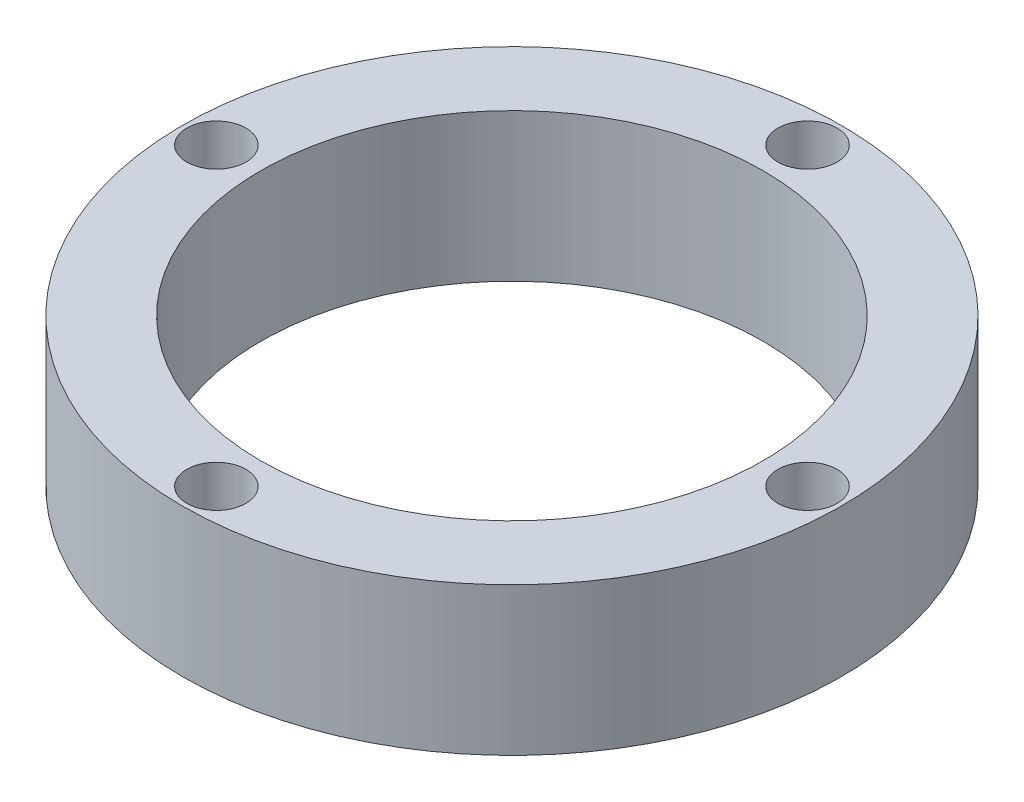
ISO-10303-21;
HEADER;
FILE_DESCRIPTION(('STEP AP214'),'2;1');
FILE_NAME('part.step','',(''),(''),'','','');
FILE_SCHEMA(('AUTOMOTIVE_DESIGN { 1 0 10303 214 1 1 1 1 }'));
ENDSEC;
DATA;
#1=APPLICATION_CONTEXT('core data for automotive mechanical design processes');
#2=APPLICATION_PROTOCOL_DEFINITION('international standard','automotive_design',2000,#1);
#3=PRODUCT_CONTEXT('',#1,'mechanical');
#4=PRODUCT('Part','Part','',(#3));
#5=PRODUCT_RELATED_PRODUCT_CATEGORY('part','',(#4));
#6=PRODUCT_DEFINITION_FORMATION('','',#4);
#7=PRODUCT_DEFINITION_CONTEXT('part definition',#1,'design');
#8=PRODUCT_DEFINITION('design','',#6,#7);
#9=PRODUCT_DEFINITION_SHAPE('','',#8);
#10=(LENGTH_UNIT() NAMED_UNIT(*) SI_UNIT(.MILLI.,.METRE.));
#11=(NAMED_UNIT(*) PLANE_ANGLE_UNIT() SI_UNIT($,.RADIAN.));
#12=(NAMED_UNIT(*) SI_UNIT($,.STERADIAN.) SOLID_ANGLE_UNIT());
#13=UNCERTAINTY_MEASURE_WITH_UNIT(LENGTH_MEASURE(1.E-05),#10,'distance_accuracy_value','');
#14=(GEOMETRIC_REPRESENTATION_CONTEXT(3) GLOBAL_UNCERTAINTY_ASSIGNED_CONTEXT((#13)) GLOBAL_UNIT_ASSIGNED_CONTEXT((#10,
#11,#12)) REPRESENTATION_CONTEXT('',''));
#15=CARTESIAN_POINT('',(0.,0.,0.));
#16=DIRECTION('',(0.,0.,1.));
#17=DIRECTION('',(1.,0.,0.));
#18=AXIS2_PLACEMENT_3D('',#15,#16,#17);
#19=CARTESIAN_POINT('',(0.,10.,0.));
#20=DIRECTION('',(0.,1.,0.));
#21=DIRECTION('',(0.,0.,1.));
#22=AXIS2_PLACEMENT_3D('',#19,#20,#21);
#23=PLANE('',#22);
#24=CARTESIAN_POINT('',(0.,10.,-20.));
#25=DIRECTION('',(0.,1.,0.));
#26=DIRECTION('',(0.,0.,1.));
#27=AXIS2_PLACEMENT_3D('',#24,#25,#26);
#28=CIRCLE('',#27,2.);
#29=CARTESIAN_POINT('',(0.,10.,-18.));
#30=VERTEX_POINT('',#29);
#31=EDGE_CURVE('E68',#30,#30,#28,.T.);
#32=ORIENTED_EDGE('',*,*,#31,.F.);
#33=EDGE_LOOP('',(#32));
#34=FACE_BOUND('',#33,.T.);
#35=CARTESIAN_POINT('',(20.0000000000006,10.,-5.65984895009786E-13));
#36=DIRECTION('',(0.,1.,0.));
#37=DIRECTION('',(0.,0.,1.));
#38=AXIS2_PLACEMENT_3D('',#35,#36,#37);
#39=CIRCLE('',#38,2.00000000000044);
#40=CARTESIAN_POINT('',(20.0000000000006,10.,1.99999999999988));
#41=VERTEX_POINT('',#40);
#42=EDGE_CURVE('E65',#41,#41,#39,.T.);
#43=ORIENTED_EDGE('',*,*,#42,.F.);
#44=EDGE_LOOP('',(#43));
#45=FACE_BOUND('',#44,.T.);
#46=CARTESIAN_POINT('',(1.13196979001957E-12,10.,20.));
#47=DIRECTION('',(0.,1.,0.));
#48=DIRECTION('',(0.,0.,1.));
#49=AXIS2_PLACEMENT_3D('',#46,#47,#48);
#50=CIRCLE('',#49,2.00000000000122);
#51=CARTESIAN_POINT('',(1.13196979001957E-12,10.,22.0000000000012));
#52=VERTEX_POINT('',#51);
#53=EDGE_CURVE('E59',#52,#52,#50,.T.);
#54=ORIENTED_EDGE('',*,*,#53,.F.);
#55=EDGE_LOOP('',(#54));
#56=FACE_BOUND('',#55,.T.);
#57=CARTESIAN_POINT('',(-19.9999999999994,10.,5.6843418860808E-13));
#58=DIRECTION('',(0.,1.,0.));
#59=DIRECTION('',(0.,0.,1.));
#60=AXIS2_PLACEMENT_3D('',#57,#58,#59);
#61=CIRCLE('',#60,2.00000000000091);
#62=CARTESIAN_POINT('',(-19.9999999999994,10.,2.00000000000148));
#63=VERTEX_POINT('',#62);
#64=EDGE_CURVE('E53',#63,#63,#61,.T.);
#65=ORIENTED_EDGE('',*,*,#64,.F.);
#66=EDGE_LOOP('',(#65));
#67=FACE_BOUND('',#66,.T.);
#68=CARTESIAN_POINT('',(0.,10.,0.));
#69=DIRECTION('',(0.,1.,0.));
#70=DIRECTION('',(0.,0.,1.));
#71=AXIS2_PLACEMENT_3D('',#68,#69,#70);
#72=CIRCLE('',#71,22.30053667254);
#73=CARTESIAN_POINT('',(0.,10.,22.30053667254));
#74=VERTEX_POINT('',#73);
#75=EDGE_CURVE('E10',#74,#74,#72,.T.);
#76=ORIENTED_EDGE('',*,*,#75,.T.);
#77=EDGE_LOOP('',(#76));
#78=FACE_BOUND('',#77,.T.);
#79=CARTESIAN_POINT('',(0.,10.,0.));
#80=DIRECTION('',(0.,1.,0.));
#81=DIRECTION('',(0.,0.,1.));
#82=AXIS2_PLACEMENT_3D('',#79,#80,#81);
#83=CIRCLE('',#82,17.);
#84=CARTESIAN_POINT('',(0.,10.,17.));
#85=VERTEX_POINT('',#84);
#86=EDGE_CURVE('E42',#85,#85,#83,.T.);
#87=ORIENTED_EDGE('',*,*,#86,.F.);
#88=EDGE_LOOP('',(#87));
#89=FACE_BOUND('',#88,.T.);
#90=ADVANCED_FACE('F31',(#34,#45,#56,#67,#78,#89),#23,.T.);
#91=CARTESIAN_POINT('',(0.,0.,0.));
#92=DIRECTION('',(0.,1.,0.));
#93=DIRECTION('',(0.,0.,1.));
#94=AXIS2_PLACEMENT_3D('',#91,#92,#93);
#95=PLANE('',#94);
#96=CARTESIAN_POINT('',(0.,0.,-20.));
#97=DIRECTION('',(0.,1.,0.));
#98=DIRECTION('',(0.,0.,1.));
#99=AXIS2_PLACEMENT_3D('',#96,#97,#98);
#100=CIRCLE('',#99,2.);
#101=CARTESIAN_POINT('',(0.,0.,-18.));
#102=VERTEX_POINT('',#101);
#103=EDGE_CURVE('E47',#102,#102,#100,.T.);
#104=ORIENTED_EDGE('',*,*,#103,.T.);
#105=EDGE_LOOP('',(#104));
#106=FACE_BOUND('',#105,.T.);
#107=CARTESIAN_POINT('',(20.0000000000006,0.,-5.65984895009786E-13));
#108=DIRECTION('',(0.,1.,0.));
#109=DIRECTION('',(0.,0.,1.));
#110=AXIS2_PLACEMENT_3D('',#107,#108,#109);
#111=CIRCLE('',#110,2.00000000000044);
#112=CARTESIAN_POINT('',(20.0000000000006,0.,1.99999999999988));
#113=VERTEX_POINT('',#112);
#114=EDGE_CURVE('E62',#113,#113,#111,.T.);
#115=ORIENTED_EDGE('',*,*,#114,.T.);
#116=EDGE_LOOP('',(#115));
#117=FACE_BOUND('',#116,.T.);
#118=CARTESIAN_POINT('',(1.13196979001957E-12,0.,20.));
#119=DIRECTION('',(0.,1.,0.));
#120=DIRECTION('',(0.,0.,1.));
#121=AXIS2_PLACEMENT_3D('',#118,#119,#120);
#122=CIRCLE('',#121,2.00000000000122);
#123=CARTESIAN_POINT('',(1.13196979001957E-12,0.,22.0000000000012));
#124=VERTEX_POINT('',#123);
#125=EDGE_CURVE('E56',#124,#124,#122,.T.);
#126=ORIENTED_EDGE('',*,*,#125,.T.);
#127=EDGE_LOOP('',(#126));
#128=FACE_BOUND('',#127,.T.);
#129=CARTESIAN_POINT('',(-19.9999999999994,0.,5.6843418860808E-13));
#130=DIRECTION('',(0.,1.,0.));
#131=DIRECTION('',(0.,0.,1.));
#132=AXIS2_PLACEMENT_3D('',#129,#130,#131);
#133=CIRCLE('',#132,2.00000000000091);
#134=CARTESIAN_POINT('',(-19.9999999999994,0.,2.00000000000148));
#135=VERTEX_POINT('',#134);
#136=EDGE_CURVE('E50',#135,#135,#133,.T.);
#137=ORIENTED_EDGE('',*,*,#136,.T.);
#138=EDGE_LOOP('',(#137));
#139=FACE_BOUND('',#138,.T.);
#140=CARTESIAN_POINT('',(0.,0.,0.));
#141=DIRECTION('',(0.,1.,0.));
#142=DIRECTION('',(0.,0.,1.));
#143=AXIS2_PLACEMENT_3D('',#140,#141,#142);
#144=CIRCLE('',#143,22.30053667254);
#145=CARTESIAN_POINT('',(0.,0.,22.30053667254));
#146=VERTEX_POINT('',#145);
#147=EDGE_CURVE('E35',#146,#146,#144,.T.);
#148=ORIENTED_EDGE('',*,*,#147,.F.);
#149=EDGE_LOOP('',(#148));
#150=FACE_BOUND('',#149,.T.);
#151=CARTESIAN_POINT('',(0.,0.,0.));
#152=DIRECTION('',(0.,1.,0.));
#153=DIRECTION('',(0.,0.,1.));
#154=AXIS2_PLACEMENT_3D('',#151,#152,#153);
#155=CIRCLE('',#154,17.);
#156=CARTESIAN_POINT('',(0.,0.,17.));
#157=VERTEX_POINT('',#156);
#158=EDGE_CURVE('E44',#157,#157,#155,.T.);
#159=ORIENTED_EDGE('',*,*,#158,.T.);
#160=EDGE_LOOP('',(#159));
#161=FACE_BOUND('',#160,.T.);
#162=ADVANCED_FACE('F74',(#106,#117,#128,#139,#150,#161),#95,.F.);
#163=CARTESIAN_POINT('',(0.,10.,0.));
#164=DIRECTION('',(0.,-1.,0.));
#165=DIRECTION('',(0.,0.,-1.));
#166=AXIS2_PLACEMENT_3D('',#163,#164,#165);
#167=CYLINDRICAL_SURFACE('',#166,22.30053667254);
#168=ORIENTED_EDGE('',*,*,#75,.F.);
#169=EDGE_LOOP('',(#168));
#170=FACE_BOUND('',#169,.T.);
#171=ORIENTED_EDGE('',*,*,#147,.T.);
#172=EDGE_LOOP('',(#171));
#173=FACE_BOUND('',#172,.T.);
#174=ADVANCED_FACE('F33',(#170,#173),#167,.T.);
#175=CARTESIAN_POINT('',(0.,10.,0.));
#176=DIRECTION('',(0.,-1.,0.));
#177=DIRECTION('',(0.,0.,-1.));
#178=AXIS2_PLACEMENT_3D('',#175,#176,#177);
#179=CYLINDRICAL_SURFACE('',#178,17.);
#180=ORIENTED_EDGE('',*,*,#86,.T.);
#181=EDGE_LOOP('',(#180));
#182=FACE_BOUND('',#181,.T.);
#183=ORIENTED_EDGE('',*,*,#158,.F.);
#184=EDGE_LOOP('',(#183));
#185=FACE_BOUND('',#184,.T.);
#186=ADVANCED_FACE('F95',(#182,#185),#179,.F.);
#187=CARTESIAN_POINT('',(-19.9999999999994,0.,5.6843418860808E-13));
#188=DIRECTION('',(0.,1.,0.));
#189=DIRECTION('',(0.,0.,1.));
#190=AXIS2_PLACEMENT_3D('',#187,#188,#189);
#191=CYLINDRICAL_SURFACE('',#190,2.00000000000091);
#192=ORIENTED_EDGE('',*,*,#136,.F.);
#193=EDGE_LOOP('',(#192));
#194=FACE_BOUND('',#193,.T.);
#195=ORIENTED_EDGE('',*,*,#64,.T.);
#196=EDGE_LOOP('',(#195));
#197=FACE_BOUND('',#196,.T.);
#198=ADVANCED_FACE('F98',(#194,#197),#191,.F.);
#199=CARTESIAN_POINT('',(1.13196979001957E-12,0.,20.));
#200=DIRECTION('',(0.,1.,0.));
#201=DIRECTION('',(0.,0.,1.));
#202=AXIS2_PLACEMENT_3D('',#199,#200,#201);
#203=CYLINDRICAL_SURFACE('',#202,2.00000000000122);
#204=ORIENTED_EDGE('',*,*,#125,.F.);
#205=EDGE_LOOP('',(#204));
#206=FACE_BOUND('',#205,.T.);
#207=ORIENTED_EDGE('',*,*,#53,.T.);
#208=EDGE_LOOP('',(#207));
#209=FACE_BOUND('',#208,.T.);
#210=ADVANCED_FACE('F110',(#206,#209),#203,.F.);
#211=CARTESIAN_POINT('',(20.0000000000006,0.,-5.65984895009786E-13));
#212=DIRECTION('',(0.,1.,0.));
#213=DIRECTION('',(0.,0.,1.));
#214=AXIS2_PLACEMENT_3D('',#211,#212,#213);
#215=CYLINDRICAL_SURFACE('',#214,2.00000000000044);
#216=ORIENTED_EDGE('',*,*,#114,.F.);
#217=EDGE_LOOP('',(#216));
#218=FACE_BOUND('',#217,.T.);
#219=ORIENTED_EDGE('',*,*,#42,.T.);
#220=EDGE_LOOP('',(#219));
#221=FACE_BOUND('',#220,.T.);
#222=ADVANCED_FACE('F80',(#218,#221),#215,.F.);
#223=CARTESIAN_POINT('',(0.,0.,-20.));
#224=DIRECTION('',(0.,1.,0.));
#225=DIRECTION('',(0.,0.,1.));
#226=AXIS2_PLACEMENT_3D('',#223,#224,#225);
#227=CYLINDRICAL_SURFACE('',#226,2.);
#228=ORIENTED_EDGE('',*,*,#103,.F.);
#229=EDGE_LOOP('',(#228));
#230=FACE_BOUND('',#229,.T.);
#231=ORIENTED_EDGE('',*,*,#31,.T.);
#232=EDGE_LOOP('',(#231));
#233=FACE_BOUND('',#232,.T.);
#234=ADVANCED_FACE('F77',(#230,#233),#227,.F.);
#235=CLOSED_SHELL('',(#90,#162,#174,#186,#198,#210,#222,#234));
#236=MANIFOLD_SOLID_BREP('B2',#235);
#237=ADVANCED_BREP_SHAPE_REPRESENTATION('',(#18,#236),#14);
#238=SHAPE_DEFINITION_REPRESENTATION(#9,#237);
ENDSEC;
END-ISO-10303-21;
